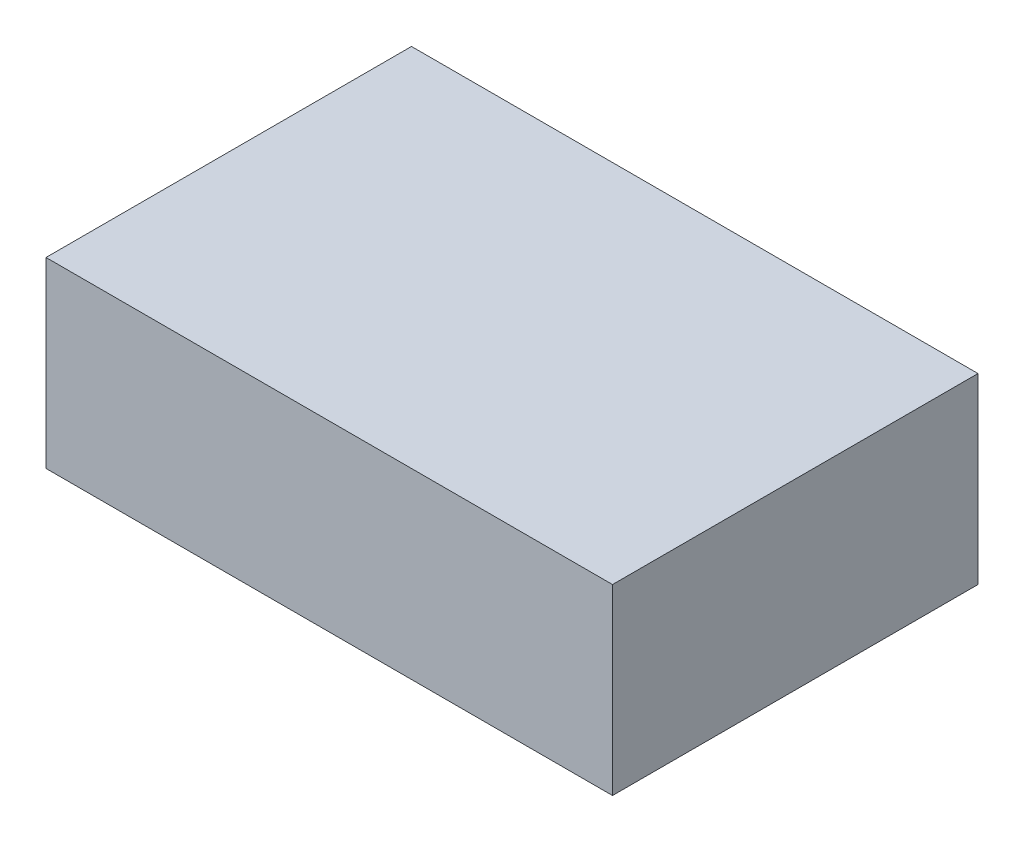
ISO-10303-21;
HEADER;
FILE_DESCRIPTION(('STEP AP214'),'2;1');
FILE_NAME('part.step','',(''),(''),'','','');
FILE_SCHEMA(('AUTOMOTIVE_DESIGN { 1 0 10303 214 1 1 1 1 }'));
ENDSEC;
DATA;
#1=APPLICATION_CONTEXT('core data for automotive mechanical design processes');
#2=APPLICATION_PROTOCOL_DEFINITION('international standard','automotive_design',2000,#1);
#3=PRODUCT_CONTEXT('',#1,'mechanical');
#4=PRODUCT('Part','Part','',(#3));
#5=PRODUCT_RELATED_PRODUCT_CATEGORY('part','',(#4));
#6=PRODUCT_DEFINITION_FORMATION('','',#4);
#7=PRODUCT_DEFINITION_CONTEXT('part definition',#1,'design');
#8=PRODUCT_DEFINITION('design','',#6,#7);
#9=PRODUCT_DEFINITION_SHAPE('','',#8);
#10=(LENGTH_UNIT() NAMED_UNIT(*) SI_UNIT(.MILLI.,.METRE.));
#11=(NAMED_UNIT(*) PLANE_ANGLE_UNIT() SI_UNIT($,.RADIAN.));
#12=(NAMED_UNIT(*) SI_UNIT($,.STERADIAN.) SOLID_ANGLE_UNIT());
#13=UNCERTAINTY_MEASURE_WITH_UNIT(LENGTH_MEASURE(1.E-05),#10,'distance_accuracy_value','');
#14=(GEOMETRIC_REPRESENTATION_CONTEXT(3) GLOBAL_UNCERTAINTY_ASSIGNED_CONTEXT((#13)) GLOBAL_UNIT_ASSIGNED_CONTEXT((#10,
#11,#12)) REPRESENTATION_CONTEXT('',''));
#15=CARTESIAN_POINT('',(0.,0.,0.));
#16=DIRECTION('',(0.,0.,1.));
#17=DIRECTION('',(1.,0.,0.));
#18=AXIS2_PLACEMENT_3D('',#15,#16,#17);
#19=CARTESIAN_POINT('',(0.,10.,0.));
#20=DIRECTION('',(1.,0.,0.));
#21=DIRECTION('',(0.,0.,-1.));
#22=AXIS2_PLACEMENT_3D('',#19,#20,#21);
#23=PLANE('',#22);
#24=DIRECTION('',(0.,0.,1.));
#25=VECTOR('',#24,1.);
#26=CARTESIAN_POINT('',(0.,0.,0.));
#27=LINE('',#26,#25);
#28=CARTESIAN_POINT('',(0.,0.,-20.));
#29=VERTEX_POINT('',#28);
#30=CARTESIAN_POINT('',(0.,0.,0.));
#31=VERTEX_POINT('',#30);
#32=EDGE_CURVE('E105',#29,#31,#27,.T.);
#33=ORIENTED_EDGE('',*,*,#32,.T.);
#34=DIRECTION('',(0.,-1.,0.));
#35=VECTOR('',#34,1.);
#36=CARTESIAN_POINT('',(0.,10.,0.));
#37=LINE('',#36,#35);
#38=CARTESIAN_POINT('',(0.,10.,0.));
#39=VERTEX_POINT('',#38);
#40=EDGE_CURVE('E11',#39,#31,#37,.T.);
#41=ORIENTED_EDGE('',*,*,#40,.F.);
#42=DIRECTION('',(0.,0.,1.));
#43=VECTOR('',#42,1.);
#44=CARTESIAN_POINT('',(0.,10.,0.));
#45=LINE('',#44,#43);
#46=CARTESIAN_POINT('',(0.,10.,-20.));
#47=VERTEX_POINT('',#46);
#48=EDGE_CURVE('E89',#47,#39,#45,.T.);
#49=ORIENTED_EDGE('',*,*,#48,.F.);
#50=DIRECTION('',(0.,-1.,0.));
#51=VECTOR('',#50,1.);
#52=CARTESIAN_POINT('',(0.,10.,-20.));
#53=LINE('',#52,#51);
#54=EDGE_CURVE('E97',#47,#29,#53,.T.);
#55=ORIENTED_EDGE('',*,*,#54,.T.);
#56=EDGE_LOOP('',(#33,#41,#49,#55));
#57=FACE_BOUND('',#56,.T.);
#58=ADVANCED_FACE('F39',(#57),#23,.F.);
#59=CARTESIAN_POINT('',(0.,10.,0.));
#60=DIRECTION('',(0.,0.,-1.));
#61=DIRECTION('',(-1.,0.,0.));
#62=AXIS2_PLACEMENT_3D('',#59,#60,#61);
#63=PLANE('',#62);
#64=DIRECTION('',(1.,0.,0.));
#65=VECTOR('',#64,1.);
#66=CARTESIAN_POINT('',(0.,0.,0.));
#67=LINE('',#66,#65);
#68=CARTESIAN_POINT('',(31.,0.,0.));
#69=VERTEX_POINT('',#68);
#70=EDGE_CURVE('E92',#31,#69,#67,.T.);
#71=ORIENTED_EDGE('',*,*,#70,.T.);
#72=DIRECTION('',(0.,-1.,0.));
#73=VECTOR('',#72,1.);
#74=CARTESIAN_POINT('',(31.,10.,0.));
#75=LINE('',#74,#73);
#76=CARTESIAN_POINT('',(31.,10.,0.));
#77=VERTEX_POINT('',#76);
#78=EDGE_CURVE('E50',#77,#69,#75,.T.);
#79=ORIENTED_EDGE('',*,*,#78,.F.);
#80=DIRECTION('',(1.,0.,0.));
#81=VECTOR('',#80,1.);
#82=CARTESIAN_POINT('',(0.,10.,0.));
#83=LINE('',#82,#81);
#84=EDGE_CURVE('E82',#39,#77,#83,.T.);
#85=ORIENTED_EDGE('',*,*,#84,.F.);
#86=ORIENTED_EDGE('',*,*,#40,.T.);
#87=EDGE_LOOP('',(#71,#79,#85,#86));
#88=FACE_BOUND('',#87,.T.);
#89=ADVANCED_FACE('F93',(#88),#63,.F.);
#90=CARTESIAN_POINT('',(31.,10.,0.));
#91=DIRECTION('',(-1.,0.,0.));
#92=DIRECTION('',(0.,0.,1.));
#93=AXIS2_PLACEMENT_3D('',#90,#91,#92);
#94=PLANE('',#93);
#95=DIRECTION('',(0.,0.,-1.));
#96=VECTOR('',#95,1.);
#97=CARTESIAN_POINT('',(31.,0.,0.));
#98=LINE('',#97,#96);
#99=CARTESIAN_POINT('',(31.,0.,-20.));
#100=VERTEX_POINT('',#99);
#101=EDGE_CURVE('E72',#69,#100,#98,.T.);
#102=ORIENTED_EDGE('',*,*,#101,.T.);
#103=DIRECTION('',(0.,-1.,0.));
#104=VECTOR('',#103,1.);
#105=CARTESIAN_POINT('',(31.,10.,-20.));
#106=LINE('',#105,#104);
#107=CARTESIAN_POINT('',(31.,10.,-20.));
#108=VERTEX_POINT('',#107);
#109=EDGE_CURVE('E94',#108,#100,#106,.T.);
#110=ORIENTED_EDGE('',*,*,#109,.F.);
#111=DIRECTION('',(0.,0.,-1.));
#112=VECTOR('',#111,1.);
#113=CARTESIAN_POINT('',(31.,10.,0.));
#114=LINE('',#113,#112);
#115=EDGE_CURVE('E88',#77,#108,#114,.T.);
#116=ORIENTED_EDGE('',*,*,#115,.F.);
#117=ORIENTED_EDGE('',*,*,#78,.T.);
#118=EDGE_LOOP('',(#102,#110,#116,#117));
#119=FACE_BOUND('',#118,.T.);
#120=ADVANCED_FACE('F96',(#119),#94,.F.);
#121=CARTESIAN_POINT('',(0.,10.,-20.));
#122=DIRECTION('',(0.,0.,1.));
#123=DIRECTION('',(1.,0.,0.));
#124=AXIS2_PLACEMENT_3D('',#121,#122,#123);
#125=PLANE('',#124);
#126=DIRECTION('',(-1.,0.,0.));
#127=VECTOR('',#126,1.);
#128=CARTESIAN_POINT('',(0.,0.,-20.));
#129=LINE('',#128,#127);
#130=EDGE_CURVE('E76',#100,#29,#129,.T.);
#131=ORIENTED_EDGE('',*,*,#130,.T.);
#132=ORIENTED_EDGE('',*,*,#54,.F.);
#133=DIRECTION('',(-1.,0.,0.));
#134=VECTOR('',#133,1.);
#135=CARTESIAN_POINT('',(0.,10.,-20.));
#136=LINE('',#135,#134);
#137=EDGE_CURVE('E54',#108,#47,#136,.T.);
#138=ORIENTED_EDGE('',*,*,#137,.F.);
#139=ORIENTED_EDGE('',*,*,#109,.T.);
#140=EDGE_LOOP('',(#131,#132,#138,#139));
#141=FACE_BOUND('',#140,.T.);
#142=ADVANCED_FACE('F108',(#141),#125,.F.);
#143=CARTESIAN_POINT('',(0.,10.,0.));
#144=DIRECTION('',(0.,-1.,0.));
#145=DIRECTION('',(0.,0.,-1.));
#146=AXIS2_PLACEMENT_3D('',#143,#144,#145);
#147=PLANE('',#146);
#148=ORIENTED_EDGE('',*,*,#48,.T.);
#149=ORIENTED_EDGE('',*,*,#84,.T.);
#150=ORIENTED_EDGE('',*,*,#115,.T.);
#151=ORIENTED_EDGE('',*,*,#137,.T.);
#152=EDGE_LOOP('',(#148,#149,#150,#151));
#153=FACE_BOUND('',#152,.T.);
#154=ADVANCED_FACE('F86',(#153),#147,.F.);
#155=CARTESIAN_POINT('',(0.,0.,0.));
#156=DIRECTION('',(0.,-1.,0.));
#157=DIRECTION('',(0.,0.,-1.));
#158=AXIS2_PLACEMENT_3D('',#155,#156,#157);
#159=PLANE('',#158);
#160=ORIENTED_EDGE('',*,*,#32,.F.);
#161=ORIENTED_EDGE('',*,*,#130,.F.);
#162=ORIENTED_EDGE('',*,*,#101,.F.);
#163=ORIENTED_EDGE('',*,*,#70,.F.);
#164=EDGE_LOOP('',(#160,#161,#162,#163));
#165=FACE_BOUND('',#164,.T.);
#166=ADVANCED_FACE('F115',(#165),#159,.T.);
#167=CLOSED_SHELL('',(#58,#89,#120,#142,#154,#166));
#168=MANIFOLD_SOLID_BREP('B2',#167);
#169=ADVANCED_BREP_SHAPE_REPRESENTATION('',(#18,#168),#14);
#170=SHAPE_DEFINITION_REPRESENTATION(#9,#169);
ENDSEC;
END-ISO-10303-21;
